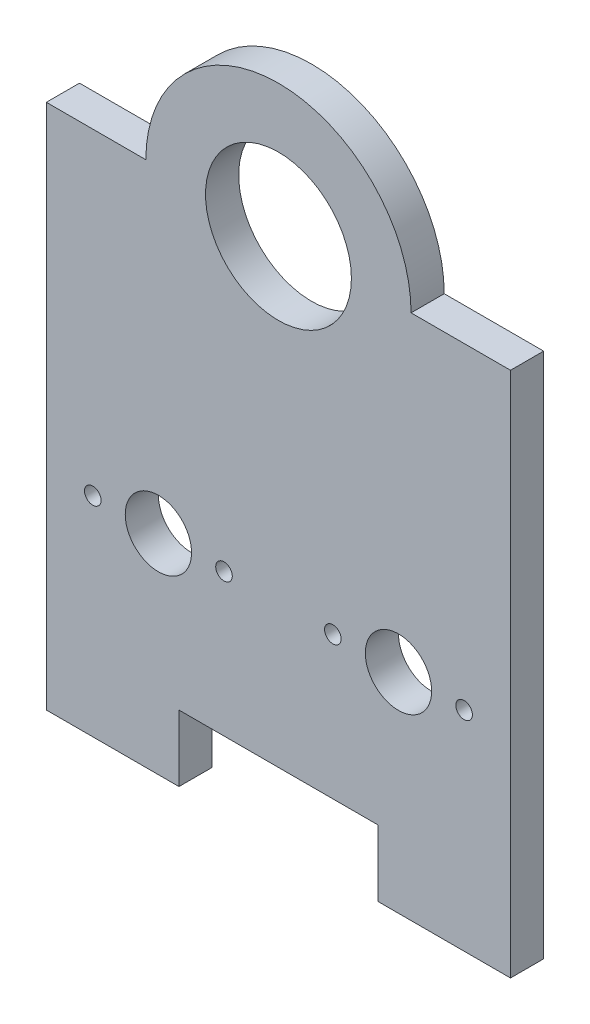
ISO-10303-21;
HEADER;
FILE_DESCRIPTION(('STEP AP214'),'2;1');
FILE_NAME('part.step','',(''),(''),'','','');
FILE_SCHEMA(('AUTOMOTIVE_DESIGN { 1 0 10303 214 1 1 1 1 }'));
ENDSEC;
DATA;
#1=APPLICATION_CONTEXT('core data for automotive mechanical design processes');
#2=APPLICATION_PROTOCOL_DEFINITION('international standard','automotive_design',2000,#1);
#3=PRODUCT_CONTEXT('',#1,'mechanical');
#4=PRODUCT('Part','Part','',(#3));
#5=PRODUCT_RELATED_PRODUCT_CATEGORY('part','',(#4));
#6=PRODUCT_DEFINITION_FORMATION('','',#4);
#7=PRODUCT_DEFINITION_CONTEXT('part definition',#1,'design');
#8=PRODUCT_DEFINITION('design','',#6,#7);
#9=PRODUCT_DEFINITION_SHAPE('','',#8);
#10=(LENGTH_UNIT() NAMED_UNIT(*) SI_UNIT(.MILLI.,.METRE.));
#11=(NAMED_UNIT(*) PLANE_ANGLE_UNIT() SI_UNIT($,.RADIAN.));
#12=(NAMED_UNIT(*) SI_UNIT($,.STERADIAN.) SOLID_ANGLE_UNIT());
#13=UNCERTAINTY_MEASURE_WITH_UNIT(LENGTH_MEASURE(1.E-05),#10,'distance_accuracy_value','');
#14=(GEOMETRIC_REPRESENTATION_CONTEXT(3) GLOBAL_UNCERTAINTY_ASSIGNED_CONTEXT((#13)) GLOBAL_UNIT_ASSIGNED_CONTEXT((#10,
#11,#12)) REPRESENTATION_CONTEXT('',''));
#15=CARTESIAN_POINT('',(0.,0.,0.));
#16=DIRECTION('',(0.,0.,1.));
#17=DIRECTION('',(1.,0.,0.));
#18=AXIS2_PLACEMENT_3D('',#15,#16,#17);
#19=CARTESIAN_POINT('',(18.1,47.8769046791988,5.));
#20=DIRECTION('',(0.,0.,1.));
#21=DIRECTION('',(1.,0.,0.));
#22=AXIS2_PLACEMENT_3D('',#19,#20,#21);
#23=PLANE('',#22);
#24=CARTESIAN_POINT('',(26.305,0.,5.));
#25=DIRECTION('',(0.,0.,1.));
#26=DIRECTION('',(1.,0.,0.));
#27=AXIS2_PLACEMENT_3D('',#24,#25,#26);
#28=CIRCLE('',#27,1.25);
#29=CARTESIAN_POINT('',(27.555,0.,5.));
#30=VERTEX_POINT('',#29);
#31=EDGE_CURVE('E239',#30,#30,#28,.T.);
#32=ORIENTED_EDGE('',*,*,#31,.F.);
#33=EDGE_LOOP('',(#32));
#34=FACE_BOUND('',#33,.T.);
#35=CARTESIAN_POINT('',(46.095,0.,5.));
#36=DIRECTION('',(0.,0.,1.));
#37=DIRECTION('',(1.,0.,0.));
#38=AXIS2_PLACEMENT_3D('',#35,#36,#37);
#39=CIRCLE('',#38,1.25);
#40=CARTESIAN_POINT('',(47.345,0.,5.));
#41=VERTEX_POINT('',#40);
#42=EDGE_CURVE('E227',#41,#41,#39,.T.);
#43=ORIENTED_EDGE('',*,*,#42,.F.);
#44=EDGE_LOOP('',(#43));
#45=FACE_BOUND('',#44,.T.);
#46=CARTESIAN_POINT('',(9.88809909928717,0.00118316758123989,5.));
#47=DIRECTION('',(0.,0.,1.));
#48=DIRECTION('',(-1.,0.,0.));
#49=AXIS2_PLACEMENT_3D('',#46,#47,#48);
#50=CIRCLE('',#49,1.25000000000001);
#51=CARTESIAN_POINT('',(8.63809909928716,0.00118316758123989,5.));
#52=VERTEX_POINT('',#51);
#53=EDGE_CURVE('E215',#52,#52,#50,.T.);
#54=ORIENTED_EDGE('',*,*,#53,.F.);
#55=EDGE_LOOP('',(#54));
#56=FACE_BOUND('',#55,.T.);
#57=DIRECTION('',(0.,-1.,0.));
#58=VECTOR('',#57,1.);
#59=CARTESIAN_POINT('',(33.095,-21.5,5.));
#60=LINE('',#59,#58);
#61=CARTESIAN_POINT('',(33.095,-21.5,5.));
#62=VERTEX_POINT('',#61);
#63=CARTESIAN_POINT('',(33.095,-31.5,5.));
#64=VERTEX_POINT('',#63);
#65=EDGE_CURVE('E163',#62,#64,#60,.T.);
#66=ORIENTED_EDGE('',*,*,#65,.T.);
#67=DIRECTION('',(1.,0.,0.));
#68=VECTOR('',#67,1.);
#69=CARTESIAN_POINT('',(53.095,-31.5,5.));
#70=LINE('',#69,#68);
#71=CARTESIAN_POINT('',(53.095,-31.5,5.));
#72=VERTEX_POINT('',#71);
#73=EDGE_CURVE('E99',#64,#72,#70,.T.);
#74=ORIENTED_EDGE('',*,*,#73,.T.);
#75=DIRECTION('',(0.,1.,0.));
#76=VECTOR('',#75,1.);
#77=CARTESIAN_POINT('',(53.095,-21.5,5.));
#78=LINE('',#77,#76);
#79=CARTESIAN_POINT('',(53.095,47.8769046791988,5.));
#80=VERTEX_POINT('',#79);
#81=EDGE_CURVE('E183',#72,#80,#78,.T.);
#82=ORIENTED_EDGE('',*,*,#81,.T.);
#83=DIRECTION('',(-1.,0.,0.));
#84=VECTOR('',#83,1.);
#85=CARTESIAN_POINT('',(38.1,47.8769046791988,5.));
#86=LINE('',#85,#84);
#87=CARTESIAN_POINT('',(38.1,47.8769046791988,5.));
#88=VERTEX_POINT('',#87);
#89=EDGE_CURVE('E204',#80,#88,#86,.T.);
#90=ORIENTED_EDGE('',*,*,#89,.T.);
#91=CARTESIAN_POINT('',(18.1,47.8769046791988,5.));
#92=DIRECTION('',(0.,0.,1.));
#93=DIRECTION('',(1.,0.,0.));
#94=AXIS2_PLACEMENT_3D('',#91,#92,#93);
#95=CIRCLE('',#94,20.);
#96=CARTESIAN_POINT('',(-1.9,47.8769046791988,5.));
#97=VERTEX_POINT('',#96);
#98=EDGE_CURVE('E201',#88,#97,#95,.T.);
#99=ORIENTED_EDGE('',*,*,#98,.T.);
#100=DIRECTION('',(-1.,0.,0.));
#101=VECTOR('',#100,1.);
#102=CARTESIAN_POINT('',(-16.905,47.8769046791988,5.));
#103=LINE('',#102,#101);
#104=CARTESIAN_POINT('',(-16.905,47.8769046791988,5.));
#105=VERTEX_POINT('',#104);
#106=EDGE_CURVE('E203',#97,#105,#103,.T.);
#107=ORIENTED_EDGE('',*,*,#106,.T.);
#108=DIRECTION('',(0.,-1.,0.));
#109=VECTOR('',#108,1.);
#110=CARTESIAN_POINT('',(-16.905,47.8769046791988,5.));
#111=LINE('',#110,#109);
#112=CARTESIAN_POINT('',(-16.905,-31.5,5.));
#113=VERTEX_POINT('',#112);
#114=EDGE_CURVE('E124',#105,#113,#111,.T.);
#115=ORIENTED_EDGE('',*,*,#114,.T.);
#116=DIRECTION('',(1.,0.,0.));
#117=VECTOR('',#116,1.);
#118=CARTESIAN_POINT('',(-16.905,-31.5,5.));
#119=LINE('',#118,#117);
#120=CARTESIAN_POINT('',(3.095,-31.5,5.));
#121=VERTEX_POINT('',#120);
#122=EDGE_CURVE('E118',#113,#121,#119,.T.);
#123=ORIENTED_EDGE('',*,*,#122,.T.);
#124=DIRECTION('',(0.,1.,0.));
#125=VECTOR('',#124,1.);
#126=CARTESIAN_POINT('',(3.095,-21.5,5.));
#127=LINE('',#126,#125);
#128=CARTESIAN_POINT('',(3.095,-21.5,5.));
#129=VERTEX_POINT('',#128);
#130=EDGE_CURVE('E122',#121,#129,#127,.T.);
#131=ORIENTED_EDGE('',*,*,#130,.T.);
#132=DIRECTION('',(1.,0.,0.));
#133=VECTOR('',#132,1.);
#134=CARTESIAN_POINT('',(3.095,-21.5,5.));
#135=LINE('',#134,#133);
#136=EDGE_CURVE('E50',#129,#62,#135,.T.);
#137=ORIENTED_EDGE('',*,*,#136,.T.);
#138=EDGE_LOOP('',(#66,#74,#82,#90,#99,#107,#115,#123,#131,#137));
#139=FACE_BOUND('',#138,.T.);
#140=CARTESIAN_POINT('',(-9.90190069513042,0.00403570186320496,5.));
#141=DIRECTION('',(0.,0.,1.));
#142=DIRECTION('',(-1.,0.,0.));
#143=AXIS2_PLACEMENT_3D('',#140,#141,#142);
#144=CIRCLE('',#143,1.25);
#145=CARTESIAN_POINT('',(-11.1519006951304,0.00403570186320496,5.));
#146=VERTEX_POINT('',#145);
#147=EDGE_CURVE('E146',#146,#146,#144,.T.);
#148=ORIENTED_EDGE('',*,*,#147,.F.);
#149=EDGE_LOOP('',(#148));
#150=FACE_BOUND('',#149,.T.);
#151=CARTESIAN_POINT('',(18.1,47.8769046791988,5.));
#152=DIRECTION('',(0.,0.,1.));
#153=DIRECTION('',(1.,0.,0.));
#154=AXIS2_PLACEMENT_3D('',#151,#152,#153);
#155=CIRCLE('',#154,11.);
#156=CARTESIAN_POINT('',(29.1,47.8769046791988,5.));
#157=VERTEX_POINT('',#156);
#158=EDGE_CURVE('E221',#157,#157,#155,.T.);
#159=ORIENTED_EDGE('',*,*,#158,.F.);
#160=EDGE_LOOP('',(#159));
#161=FACE_BOUND('',#160,.T.);
#162=CARTESIAN_POINT('',(36.2,0.,5.));
#163=DIRECTION('',(0.,0.,1.));
#164=DIRECTION('',(1.,0.,0.));
#165=AXIS2_PLACEMENT_3D('',#162,#163,#164);
#166=CIRCLE('',#165,5.);
#167=CARTESIAN_POINT('',(41.2,0.,5.));
#168=VERTEX_POINT('',#167);
#169=EDGE_CURVE('E233',#168,#168,#166,.T.);
#170=ORIENTED_EDGE('',*,*,#169,.F.);
#171=EDGE_LOOP('',(#170));
#172=FACE_BOUND('',#171,.T.);
#173=CARTESIAN_POINT('',(-0.00690079792162873,0.00260943472222319,5.));
#174=DIRECTION('',(0.,0.,1.));
#175=DIRECTION('',(-1.,0.,0.));
#176=AXIS2_PLACEMENT_3D('',#173,#174,#175);
#177=CIRCLE('',#176,5.);
#178=CARTESIAN_POINT('',(-5.00690079792163,0.00260943472222319,5.));
#179=VERTEX_POINT('',#178);
#180=EDGE_CURVE('E245',#179,#179,#177,.T.);
#181=ORIENTED_EDGE('',*,*,#180,.F.);
#182=EDGE_LOOP('',(#181));
#183=FACE_BOUND('',#182,.T.);
#184=ADVANCED_FACE('F33',(#34,#45,#56,#139,#150,#161,#172,#183),#23,.T.);
#185=CARTESIAN_POINT('',(18.1,47.8769046791988,0.));
#186=DIRECTION('',(0.,0.,1.));
#187=DIRECTION('',(1.,0.,0.));
#188=AXIS2_PLACEMENT_3D('',#185,#186,#187);
#189=PLANE('',#188);
#190=DIRECTION('',(0.,-1.,0.));
#191=VECTOR('',#190,1.);
#192=CARTESIAN_POINT('',(33.095,-21.5,0.));
#193=LINE('',#192,#191);
#194=CARTESIAN_POINT('',(33.095,-21.5,0.));
#195=VERTEX_POINT('',#194);
#196=CARTESIAN_POINT('',(33.095,-31.5,0.));
#197=VERTEX_POINT('',#196);
#198=EDGE_CURVE('E142',#195,#197,#193,.T.);
#199=ORIENTED_EDGE('',*,*,#198,.F.);
#200=DIRECTION('',(1.,0.,0.));
#201=VECTOR('',#200,1.);
#202=CARTESIAN_POINT('',(3.095,-21.5,0.));
#203=LINE('',#202,#201);
#204=CARTESIAN_POINT('',(3.095,-21.5,0.));
#205=VERTEX_POINT('',#204);
#206=EDGE_CURVE('E91',#205,#195,#203,.T.);
#207=ORIENTED_EDGE('',*,*,#206,.F.);
#208=DIRECTION('',(0.,1.,0.));
#209=VECTOR('',#208,1.);
#210=CARTESIAN_POINT('',(3.095,-21.5,0.));
#211=LINE('',#210,#209);
#212=CARTESIAN_POINT('',(3.095,-31.5,0.));
#213=VERTEX_POINT('',#212);
#214=EDGE_CURVE('E85',#213,#205,#211,.T.);
#215=ORIENTED_EDGE('',*,*,#214,.F.);
#216=DIRECTION('',(1.,0.,0.));
#217=VECTOR('',#216,1.);
#218=CARTESIAN_POINT('',(-16.905,-31.5,0.));
#219=LINE('',#218,#217);
#220=CARTESIAN_POINT('',(-16.905,-31.5,0.));
#221=VERTEX_POINT('',#220);
#222=EDGE_CURVE('E132',#221,#213,#219,.T.);
#223=ORIENTED_EDGE('',*,*,#222,.F.);
#224=DIRECTION('',(0.,-1.,0.));
#225=VECTOR('',#224,1.);
#226=CARTESIAN_POINT('',(-16.905,-21.5,0.));
#227=LINE('',#226,#225);
#228=CARTESIAN_POINT('',(-16.905,47.8769046791988,0.));
#229=VERTEX_POINT('',#228);
#230=EDGE_CURVE('E158',#229,#221,#227,.T.);
#231=ORIENTED_EDGE('',*,*,#230,.F.);
#232=DIRECTION('',(-1.,0.,0.));
#233=VECTOR('',#232,1.);
#234=CARTESIAN_POINT('',(-16.905,47.8769046791988,0.));
#235=LINE('',#234,#233);
#236=CARTESIAN_POINT('',(-1.9,47.8769046791988,0.));
#237=VERTEX_POINT('',#236);
#238=EDGE_CURVE('E155',#237,#229,#235,.T.);
#239=ORIENTED_EDGE('',*,*,#238,.F.);
#240=CARTESIAN_POINT('',(18.1,47.8769046791988,0.));
#241=DIRECTION('',(0.,0.,1.));
#242=DIRECTION('',(1.,0.,0.));
#243=AXIS2_PLACEMENT_3D('',#240,#241,#242);
#244=CIRCLE('',#243,20.);
#245=CARTESIAN_POINT('',(38.1,47.8769046791988,0.));
#246=VERTEX_POINT('',#245);
#247=EDGE_CURVE('E153',#246,#237,#244,.T.);
#248=ORIENTED_EDGE('',*,*,#247,.F.);
#249=DIRECTION('',(-1.,0.,0.));
#250=VECTOR('',#249,1.);
#251=CARTESIAN_POINT('',(38.1,47.8769046791988,0.));
#252=LINE('',#251,#250);
#253=CARTESIAN_POINT('',(53.095,47.8769046791988,0.));
#254=VERTEX_POINT('',#253);
#255=EDGE_CURVE('E151',#254,#246,#252,.T.);
#256=ORIENTED_EDGE('',*,*,#255,.F.);
#257=DIRECTION('',(0.,1.,0.));
#258=VECTOR('',#257,1.);
#259=CARTESIAN_POINT('',(53.095,47.8769046791988,0.));
#260=LINE('',#259,#258);
#261=CARTESIAN_POINT('',(53.095,-31.5,0.));
#262=VERTEX_POINT('',#261);
#263=EDGE_CURVE('E149',#262,#254,#260,.T.);
#264=ORIENTED_EDGE('',*,*,#263,.F.);
#265=DIRECTION('',(1.,0.,0.));
#266=VECTOR('',#265,1.);
#267=CARTESIAN_POINT('',(53.095,-31.5,0.));
#268=LINE('',#267,#266);
#269=EDGE_CURVE('E145',#197,#262,#268,.T.);
#270=ORIENTED_EDGE('',*,*,#269,.F.);
#271=EDGE_LOOP('',(#199,#207,#215,#223,#231,#239,#248,#256,#264,#270));
#272=FACE_BOUND('',#271,.T.);
#273=CARTESIAN_POINT('',(-9.90190069513042,0.00403570186320496,0.));
#274=DIRECTION('',(0.,0.,1.));
#275=DIRECTION('',(-1.,0.,0.));
#276=AXIS2_PLACEMENT_3D('',#273,#274,#275);
#277=CIRCLE('',#276,1.25);
#278=CARTESIAN_POINT('',(-11.1519006951304,0.00403570186320496,0.));
#279=VERTEX_POINT('',#278);
#280=EDGE_CURVE('E212',#279,#279,#277,.T.);
#281=ORIENTED_EDGE('',*,*,#280,.T.);
#282=EDGE_LOOP('',(#281));
#283=FACE_BOUND('',#282,.T.);
#284=CARTESIAN_POINT('',(9.88809909928717,0.00118316758123989,0.));
#285=DIRECTION('',(0.,0.,1.));
#286=DIRECTION('',(-1.,0.,0.));
#287=AXIS2_PLACEMENT_3D('',#284,#285,#286);
#288=CIRCLE('',#287,1.25000000000001);
#289=CARTESIAN_POINT('',(8.63809909928716,0.00118316758123989,0.));
#290=VERTEX_POINT('',#289);
#291=EDGE_CURVE('E218',#290,#290,#288,.T.);
#292=ORIENTED_EDGE('',*,*,#291,.T.);
#293=EDGE_LOOP('',(#292));
#294=FACE_BOUND('',#293,.T.);
#295=CARTESIAN_POINT('',(18.1,47.8769046791988,0.));
#296=DIRECTION('',(0.,0.,1.));
#297=DIRECTION('',(1.,0.,0.));
#298=AXIS2_PLACEMENT_3D('',#295,#296,#297);
#299=CIRCLE('',#298,11.);
#300=CARTESIAN_POINT('',(29.1,47.8769046791988,0.));
#301=VERTEX_POINT('',#300);
#302=EDGE_CURVE('E224',#301,#301,#299,.T.);
#303=ORIENTED_EDGE('',*,*,#302,.T.);
#304=EDGE_LOOP('',(#303));
#305=FACE_BOUND('',#304,.T.);
#306=CARTESIAN_POINT('',(46.095,0.,0.));
#307=DIRECTION('',(0.,0.,1.));
#308=DIRECTION('',(1.,0.,0.));
#309=AXIS2_PLACEMENT_3D('',#306,#307,#308);
#310=CIRCLE('',#309,1.25);
#311=CARTESIAN_POINT('',(47.345,0.,0.));
#312=VERTEX_POINT('',#311);
#313=EDGE_CURVE('E230',#312,#312,#310,.T.);
#314=ORIENTED_EDGE('',*,*,#313,.T.);
#315=EDGE_LOOP('',(#314));
#316=FACE_BOUND('',#315,.T.);
#317=CARTESIAN_POINT('',(36.2,0.,0.));
#318=DIRECTION('',(0.,0.,1.));
#319=DIRECTION('',(1.,0.,0.));
#320=AXIS2_PLACEMENT_3D('',#317,#318,#319);
#321=CIRCLE('',#320,5.);
#322=CARTESIAN_POINT('',(41.2,0.,0.));
#323=VERTEX_POINT('',#322);
#324=EDGE_CURVE('E236',#323,#323,#321,.T.);
#325=ORIENTED_EDGE('',*,*,#324,.T.);
#326=EDGE_LOOP('',(#325));
#327=FACE_BOUND('',#326,.T.);
#328=CARTESIAN_POINT('',(26.305,0.,0.));
#329=DIRECTION('',(0.,0.,1.));
#330=DIRECTION('',(1.,0.,0.));
#331=AXIS2_PLACEMENT_3D('',#328,#329,#330);
#332=CIRCLE('',#331,1.25);
#333=CARTESIAN_POINT('',(27.555,0.,0.));
#334=VERTEX_POINT('',#333);
#335=EDGE_CURVE('E242',#334,#334,#332,.T.);
#336=ORIENTED_EDGE('',*,*,#335,.T.);
#337=EDGE_LOOP('',(#336));
#338=FACE_BOUND('',#337,.T.);
#339=CARTESIAN_POINT('',(-0.00690079792162873,0.00260943472222319,0.));
#340=DIRECTION('',(0.,0.,1.));
#341=DIRECTION('',(-1.,0.,0.));
#342=AXIS2_PLACEMENT_3D('',#339,#340,#341);
#343=CIRCLE('',#342,5.);
#344=CARTESIAN_POINT('',(-5.00690079792163,0.00260943472222319,0.));
#345=VERTEX_POINT('',#344);
#346=EDGE_CURVE('E248',#345,#345,#343,.T.);
#347=ORIENTED_EDGE('',*,*,#346,.T.);
#348=EDGE_LOOP('',(#347));
#349=FACE_BOUND('',#348,.T.);
#350=ADVANCED_FACE('F188',(#272,#283,#294,#305,#316,#327,#338,#349),#189,.F.);
#351=CARTESIAN_POINT('',(33.095,-21.5,5.));
#352=DIRECTION('',(1.,0.,0.));
#353=DIRECTION('',(0.,0.,-1.));
#354=AXIS2_PLACEMENT_3D('',#351,#352,#353);
#355=PLANE('',#354);
#356=ORIENTED_EDGE('',*,*,#198,.T.);
#357=DIRECTION('',(0.,0.,-1.));
#358=VECTOR('',#357,1.);
#359=CARTESIAN_POINT('',(33.095,-31.5,5.));
#360=LINE('',#359,#358);
#361=EDGE_CURVE('E11',#64,#197,#360,.T.);
#362=ORIENTED_EDGE('',*,*,#361,.F.);
#363=ORIENTED_EDGE('',*,*,#65,.F.);
#364=DIRECTION('',(0.,0.,-1.));
#365=VECTOR('',#364,1.);
#366=CARTESIAN_POINT('',(33.095,-21.5,5.));
#367=LINE('',#366,#365);
#368=EDGE_CURVE('E138',#62,#195,#367,.T.);
#369=ORIENTED_EDGE('',*,*,#368,.T.);
#370=EDGE_LOOP('',(#356,#362,#363,#369));
#371=FACE_BOUND('',#370,.T.);
#372=ADVANCED_FACE('F35',(#371),#355,.F.);
#373=CARTESIAN_POINT('',(53.095,-31.5,5.));
#374=DIRECTION('',(0.,1.,0.));
#375=DIRECTION('',(0.,0.,1.));
#376=AXIS2_PLACEMENT_3D('',#373,#374,#375);
#377=PLANE('',#376);
#378=ORIENTED_EDGE('',*,*,#269,.T.);
#379=DIRECTION('',(0.,0.,-1.));
#380=VECTOR('',#379,1.);
#381=CARTESIAN_POINT('',(53.095,-31.5,5.));
#382=LINE('',#381,#380);
#383=EDGE_CURVE('E42',#72,#262,#382,.T.);
#384=ORIENTED_EDGE('',*,*,#383,.F.);
#385=ORIENTED_EDGE('',*,*,#73,.F.);
#386=ORIENTED_EDGE('',*,*,#361,.T.);
#387=EDGE_LOOP('',(#378,#384,#385,#386));
#388=FACE_BOUND('',#387,.T.);
#389=ADVANCED_FACE('F184',(#388),#377,.F.);
#390=CARTESIAN_POINT('',(53.095,47.8769046791988,5.));
#391=DIRECTION('',(-1.,0.,0.));
#392=DIRECTION('',(0.,-1.,0.));
#393=AXIS2_PLACEMENT_3D('',#390,#391,#392);
#394=PLANE('',#393);
#395=ORIENTED_EDGE('',*,*,#263,.T.);
#396=DIRECTION('',(0.,0.,-1.));
#397=VECTOR('',#396,1.);
#398=CARTESIAN_POINT('',(53.095,47.8769046791988,5.));
#399=LINE('',#398,#397);
#400=EDGE_CURVE('E176',#80,#254,#399,.T.);
#401=ORIENTED_EDGE('',*,*,#400,.F.);
#402=ORIENTED_EDGE('',*,*,#81,.F.);
#403=ORIENTED_EDGE('',*,*,#383,.T.);
#404=EDGE_LOOP('',(#395,#401,#402,#403));
#405=FACE_BOUND('',#404,.T.);
#406=ADVANCED_FACE('F181',(#405),#394,.F.);
#407=CARTESIAN_POINT('',(38.1,47.8769046791988,5.));
#408=DIRECTION('',(0.,-1.,0.));
#409=DIRECTION('',(0.,0.,-1.));
#410=AXIS2_PLACEMENT_3D('',#407,#408,#409);
#411=PLANE('',#410);
#412=ORIENTED_EDGE('',*,*,#255,.T.);
#413=DIRECTION('',(0.,0.,-1.));
#414=VECTOR('',#413,1.);
#415=CARTESIAN_POINT('',(38.1,47.8769046791988,5.));
#416=LINE('',#415,#414);
#417=EDGE_CURVE('E173',#88,#246,#416,.T.);
#418=ORIENTED_EDGE('',*,*,#417,.F.);
#419=ORIENTED_EDGE('',*,*,#89,.F.);
#420=ORIENTED_EDGE('',*,*,#400,.T.);
#421=EDGE_LOOP('',(#412,#418,#419,#420));
#422=FACE_BOUND('',#421,.T.);
#423=ADVANCED_FACE('F195',(#422),#411,.F.);
#424=CARTESIAN_POINT('',(18.1,47.8769046791988,5.));
#425=DIRECTION('',(0.,0.,-1.));
#426=DIRECTION('',(-1.,0.,0.));
#427=AXIS2_PLACEMENT_3D('',#424,#425,#426);
#428=CYLINDRICAL_SURFACE('',#427,20.);
#429=ORIENTED_EDGE('',*,*,#247,.T.);
#430=DIRECTION('',(0.,0.,-1.));
#431=VECTOR('',#430,1.);
#432=CARTESIAN_POINT('',(-1.9,47.8769046791988,5.));
#433=LINE('',#432,#431);
#434=EDGE_CURVE('E170',#97,#237,#433,.T.);
#435=ORIENTED_EDGE('',*,*,#434,.F.);
#436=ORIENTED_EDGE('',*,*,#98,.F.);
#437=ORIENTED_EDGE('',*,*,#417,.T.);
#438=EDGE_LOOP('',(#429,#435,#436,#437));
#439=FACE_BOUND('',#438,.T.);
#440=ADVANCED_FACE('F199',(#439),#428,.T.);
#441=CARTESIAN_POINT('',(-16.905,47.8769046791988,5.));
#442=DIRECTION('',(0.,-1.,0.));
#443=DIRECTION('',(1.,0.,0.));
#444=AXIS2_PLACEMENT_3D('',#441,#442,#443);
#445=PLANE('',#444);
#446=ORIENTED_EDGE('',*,*,#238,.T.);
#447=DIRECTION('',(0.,0.,-1.));
#448=VECTOR('',#447,1.);
#449=CARTESIAN_POINT('',(-16.905,47.8769046791988,5.));
#450=LINE('',#449,#448);
#451=EDGE_CURVE('E167',#105,#229,#450,.T.);
#452=ORIENTED_EDGE('',*,*,#451,.F.);
#453=ORIENTED_EDGE('',*,*,#106,.F.);
#454=ORIENTED_EDGE('',*,*,#434,.T.);
#455=EDGE_LOOP('',(#446,#452,#453,#454));
#456=FACE_BOUND('',#455,.T.);
#457=ADVANCED_FACE('F280',(#456),#445,.F.);
#458=CARTESIAN_POINT('',(-16.905,-21.5,5.));
#459=DIRECTION('',(1.,0.,0.));
#460=DIRECTION('',(0.,1.,0.));
#461=AXIS2_PLACEMENT_3D('',#458,#459,#460);
#462=PLANE('',#461);
#463=ORIENTED_EDGE('',*,*,#230,.T.);
#464=DIRECTION('',(0.,0.,-1.));
#465=VECTOR('',#464,1.);
#466=CARTESIAN_POINT('',(-16.905,-31.5,5.));
#467=LINE('',#466,#465);
#468=EDGE_CURVE('E133',#113,#221,#467,.T.);
#469=ORIENTED_EDGE('',*,*,#468,.F.);
#470=ORIENTED_EDGE('',*,*,#114,.F.);
#471=ORIENTED_EDGE('',*,*,#451,.T.);
#472=EDGE_LOOP('',(#463,#469,#470,#471));
#473=FACE_BOUND('',#472,.T.);
#474=ADVANCED_FACE('F277',(#473),#462,.F.);
#475=CARTESIAN_POINT('',(-16.905,-31.5,5.));
#476=DIRECTION('',(0.,1.,0.));
#477=DIRECTION('',(0.,0.,1.));
#478=AXIS2_PLACEMENT_3D('',#475,#476,#477);
#479=PLANE('',#478);
#480=ORIENTED_EDGE('',*,*,#222,.T.);
#481=DIRECTION('',(0.,0.,-1.));
#482=VECTOR('',#481,1.);
#483=CARTESIAN_POINT('',(3.095,-31.5,5.));
#484=LINE('',#483,#482);
#485=EDGE_CURVE('E129',#121,#213,#484,.T.);
#486=ORIENTED_EDGE('',*,*,#485,.F.);
#487=ORIENTED_EDGE('',*,*,#122,.F.);
#488=ORIENTED_EDGE('',*,*,#468,.T.);
#489=EDGE_LOOP('',(#480,#486,#487,#488));
#490=FACE_BOUND('',#489,.T.);
#491=ADVANCED_FACE('F130',(#490),#479,.F.);
#492=CARTESIAN_POINT('',(3.095,-21.5,5.));
#493=DIRECTION('',(-1.,0.,0.));
#494=DIRECTION('',(0.,0.,1.));
#495=AXIS2_PLACEMENT_3D('',#492,#493,#494);
#496=PLANE('',#495);
#497=ORIENTED_EDGE('',*,*,#214,.T.);
#498=DIRECTION('',(0.,0.,-1.));
#499=VECTOR('',#498,1.);
#500=CARTESIAN_POINT('',(3.095,-21.5,5.));
#501=LINE('',#500,#499);
#502=EDGE_CURVE('E134',#129,#205,#501,.T.);
#503=ORIENTED_EDGE('',*,*,#502,.F.);
#504=ORIENTED_EDGE('',*,*,#130,.F.);
#505=ORIENTED_EDGE('',*,*,#485,.T.);
#506=EDGE_LOOP('',(#497,#503,#504,#505));
#507=FACE_BOUND('',#506,.T.);
#508=ADVANCED_FACE('F136',(#507),#496,.F.);
#509=CARTESIAN_POINT('',(3.095,-21.5,5.));
#510=DIRECTION('',(0.,1.,0.));
#511=DIRECTION('',(0.,0.,1.));
#512=AXIS2_PLACEMENT_3D('',#509,#510,#511);
#513=PLANE('',#512);
#514=ORIENTED_EDGE('',*,*,#206,.T.);
#515=ORIENTED_EDGE('',*,*,#368,.F.);
#516=ORIENTED_EDGE('',*,*,#136,.F.);
#517=ORIENTED_EDGE('',*,*,#502,.T.);
#518=EDGE_LOOP('',(#514,#515,#516,#517));
#519=FACE_BOUND('',#518,.T.);
#520=ADVANCED_FACE('F270',(#519),#513,.F.);
#521=CARTESIAN_POINT('',(-9.90190069513042,0.00403570186320496,5.));
#522=DIRECTION('',(0.,0.,-1.));
#523=DIRECTION('',(-1.,0.,0.));
#524=AXIS2_PLACEMENT_3D('',#521,#522,#523);
#525=CYLINDRICAL_SURFACE('',#524,1.25);
#526=ORIENTED_EDGE('',*,*,#147,.T.);
#527=EDGE_LOOP('',(#526));
#528=FACE_BOUND('',#527,.T.);
#529=ORIENTED_EDGE('',*,*,#280,.F.);
#530=EDGE_LOOP('',(#529));
#531=FACE_BOUND('',#530,.T.);
#532=ADVANCED_FACE('F267',(#528,#531),#525,.F.);
#533=CARTESIAN_POINT('',(9.88809909928717,0.00118316758123989,5.));
#534=DIRECTION('',(0.,0.,-1.));
#535=DIRECTION('',(-1.,0.,0.));
#536=AXIS2_PLACEMENT_3D('',#533,#534,#535);
#537=CYLINDRICAL_SURFACE('',#536,1.25000000000001);
#538=ORIENTED_EDGE('',*,*,#53,.T.);
#539=EDGE_LOOP('',(#538));
#540=FACE_BOUND('',#539,.T.);
#541=ORIENTED_EDGE('',*,*,#291,.F.);
#542=EDGE_LOOP('',(#541));
#543=FACE_BOUND('',#542,.T.);
#544=ADVANCED_FACE('F369',(#540,#543),#537,.F.);
#545=CARTESIAN_POINT('',(18.1,47.8769046791988,5.));
#546=DIRECTION('',(0.,0.,-1.));
#547=DIRECTION('',(-1.,0.,0.));
#548=AXIS2_PLACEMENT_3D('',#545,#546,#547);
#549=CYLINDRICAL_SURFACE('',#548,11.);
#550=ORIENTED_EDGE('',*,*,#158,.T.);
#551=EDGE_LOOP('',(#550));
#552=FACE_BOUND('',#551,.T.);
#553=ORIENTED_EDGE('',*,*,#302,.F.);
#554=EDGE_LOOP('',(#553));
#555=FACE_BOUND('',#554,.T.);
#556=ADVANCED_FACE('F377',(#552,#555),#549,.F.);
#557=CARTESIAN_POINT('',(46.095,0.,5.));
#558=DIRECTION('',(0.,0.,-1.));
#559=DIRECTION('',(-1.,0.,0.));
#560=AXIS2_PLACEMENT_3D('',#557,#558,#559);
#561=CYLINDRICAL_SURFACE('',#560,1.25);
#562=ORIENTED_EDGE('',*,*,#42,.T.);
#563=EDGE_LOOP('',(#562));
#564=FACE_BOUND('',#563,.T.);
#565=ORIENTED_EDGE('',*,*,#313,.F.);
#566=EDGE_LOOP('',(#565));
#567=FACE_BOUND('',#566,.T.);
#568=ADVANCED_FACE('F385',(#564,#567),#561,.F.);
#569=CARTESIAN_POINT('',(36.2,0.,5.));
#570=DIRECTION('',(0.,0.,-1.));
#571=DIRECTION('',(-1.,0.,0.));
#572=AXIS2_PLACEMENT_3D('',#569,#570,#571);
#573=CYLINDRICAL_SURFACE('',#572,5.);
#574=ORIENTED_EDGE('',*,*,#169,.T.);
#575=EDGE_LOOP('',(#574));
#576=FACE_BOUND('',#575,.T.);
#577=ORIENTED_EDGE('',*,*,#324,.F.);
#578=EDGE_LOOP('',(#577));
#579=FACE_BOUND('',#578,.T.);
#580=ADVANCED_FACE('F394',(#576,#579),#573,.F.);
#581=CARTESIAN_POINT('',(26.305,0.,5.));
#582=DIRECTION('',(0.,0.,-1.));
#583=DIRECTION('',(-1.,0.,0.));
#584=AXIS2_PLACEMENT_3D('',#581,#582,#583);
#585=CYLINDRICAL_SURFACE('',#584,1.25);
#586=ORIENTED_EDGE('',*,*,#31,.T.);
#587=EDGE_LOOP('',(#586));
#588=FACE_BOUND('',#587,.T.);
#589=ORIENTED_EDGE('',*,*,#335,.F.);
#590=EDGE_LOOP('',(#589));
#591=FACE_BOUND('',#590,.T.);
#592=ADVANCED_FACE('F403',(#588,#591),#585,.F.);
#593=CARTESIAN_POINT('',(-0.00690079792162873,0.00260943472222319,5.));
#594=DIRECTION('',(0.,0.,-1.));
#595=DIRECTION('',(-1.,0.,0.));
#596=AXIS2_PLACEMENT_3D('',#593,#594,#595);
#597=CYLINDRICAL_SURFACE('',#596,5.);
#598=ORIENTED_EDGE('',*,*,#180,.T.);
#599=EDGE_LOOP('',(#598));
#600=FACE_BOUND('',#599,.T.);
#601=ORIENTED_EDGE('',*,*,#346,.F.);
#602=EDGE_LOOP('',(#601));
#603=FACE_BOUND('',#602,.T.);
#604=ADVANCED_FACE('F254',(#600,#603),#597,.F.);
#605=CLOSED_SHELL('',(#184,#350,#372,#389,#406,#423,#440,#457,#474,#491,#508,#520,#532,#544,
#556,#568,#580,#592,#604));
#606=MANIFOLD_SOLID_BREP('B2',#605);
#607=ADVANCED_BREP_SHAPE_REPRESENTATION('',(#18,#606),#14);
#608=SHAPE_DEFINITION_REPRESENTATION(#9,#607);
ENDSEC;
END-ISO-10303-21;
